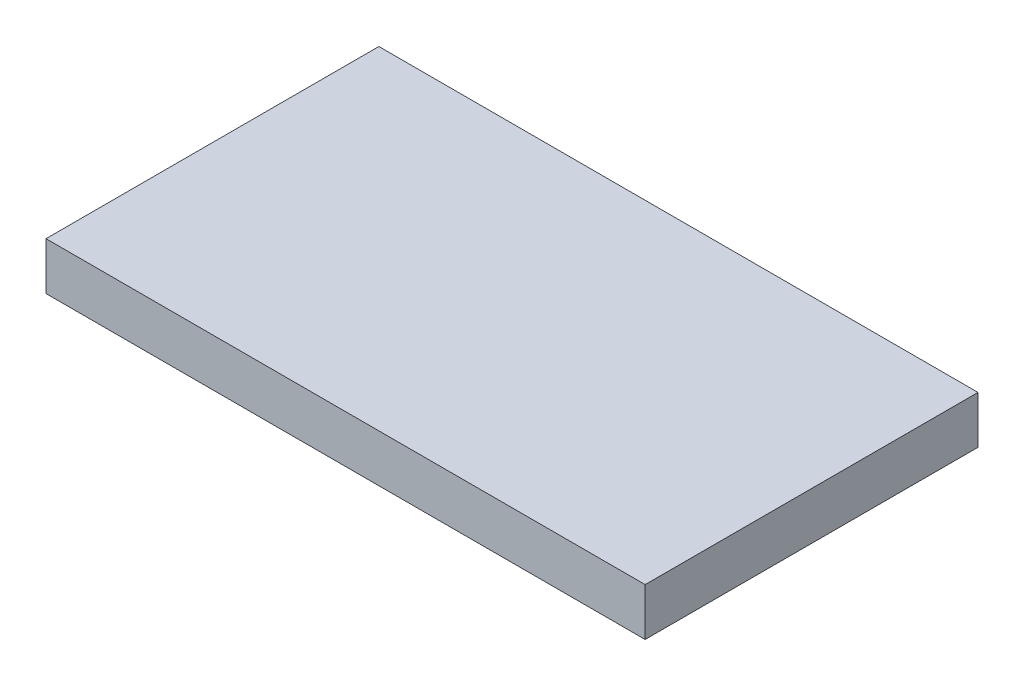
ISO-10303-21;
HEADER;
FILE_DESCRIPTION(('STEP AP214'),'2;1');
FILE_NAME('part.step','',(''),(''),'','','');
FILE_SCHEMA(('AUTOMOTIVE_DESIGN { 1 0 10303 214 1 1 1 1 }'));
ENDSEC;
DATA;
#1=APPLICATION_CONTEXT('core data for automotive mechanical design processes');
#2=APPLICATION_PROTOCOL_DEFINITION('international standard','automotive_design',2000,#1);
#3=PRODUCT_CONTEXT('',#1,'mechanical');
#4=PRODUCT('Part','Part','',(#3));
#5=PRODUCT_RELATED_PRODUCT_CATEGORY('part','',(#4));
#6=PRODUCT_DEFINITION_FORMATION('','',#4);
#7=PRODUCT_DEFINITION_CONTEXT('part definition',#1,'design');
#8=PRODUCT_DEFINITION('design','',#6,#7);
#9=PRODUCT_DEFINITION_SHAPE('','',#8);
#10=(LENGTH_UNIT() NAMED_UNIT(*) SI_UNIT(.MILLI.,.METRE.));
#11=(NAMED_UNIT(*) PLANE_ANGLE_UNIT() SI_UNIT($,.RADIAN.));
#12=(NAMED_UNIT(*) SI_UNIT($,.STERADIAN.) SOLID_ANGLE_UNIT());
#13=UNCERTAINTY_MEASURE_WITH_UNIT(LENGTH_MEASURE(1.E-05),#10,'distance_accuracy_value','');
#14=(GEOMETRIC_REPRESENTATION_CONTEXT(3) GLOBAL_UNCERTAINTY_ASSIGNED_CONTEXT((#13)) GLOBAL_UNIT_ASSIGNED_CONTEXT((#10,
#11,#12)) REPRESENTATION_CONTEXT('',''));
#15=CARTESIAN_POINT('',(0.,0.,0.));
#16=DIRECTION('',(0.,0.,1.));
#17=DIRECTION('',(1.,0.,0.));
#18=AXIS2_PLACEMENT_3D('',#15,#16,#17);
#19=CARTESIAN_POINT('',(-51.6509531623004,5.,-20.3195374115649));
#20=DIRECTION('',(1.,0.,0.));
#21=DIRECTION('',(0.,0.,-1.));
#22=AXIS2_PLACEMENT_3D('',#19,#20,#21);
#23=PLANE('',#22);
#24=DIRECTION('',(0.,0.,1.));
#25=VECTOR('',#24,1.);
#26=CARTESIAN_POINT('',(-51.6509531623004,0.,-20.3195374115649));
#27=LINE('',#26,#25);
#28=CARTESIAN_POINT('',(-51.6509531623004,0.,-20.3195374115649));
#29=VERTEX_POINT('',#28);
#30=CARTESIAN_POINT('',(-51.6509531623004,0.,14.6804625884351));
#31=VERTEX_POINT('',#30);
#32=EDGE_CURVE('E96',#29,#31,#27,.T.);
#33=ORIENTED_EDGE('',*,*,#32,.T.);
#34=DIRECTION('',(0.,-1.,0.));
#35=VECTOR('',#34,1.);
#36=CARTESIAN_POINT('',(-51.6509531623004,5.,14.6804625884351));
#37=LINE('',#36,#35);
#38=CARTESIAN_POINT('',(-51.6509531623004,5.,14.6804625884351));
#39=VERTEX_POINT('',#38);
#40=EDGE_CURVE('E11',#39,#31,#37,.T.);
#41=ORIENTED_EDGE('',*,*,#40,.F.);
#42=DIRECTION('',(0.,0.,1.));
#43=VECTOR('',#42,1.);
#44=CARTESIAN_POINT('',(-51.6509531623004,5.,-20.3195374115649));
#45=LINE('',#44,#43);
#46=CARTESIAN_POINT('',(-51.6509531623004,5.,-20.3195374115649));
#47=VERTEX_POINT('',#46);
#48=EDGE_CURVE('E84',#47,#39,#45,.T.);
#49=ORIENTED_EDGE('',*,*,#48,.F.);
#50=DIRECTION('',(0.,-1.,0.));
#51=VECTOR('',#50,1.);
#52=CARTESIAN_POINT('',(-51.6509531623004,5.,-20.3195374115649));
#53=LINE('',#52,#51);
#54=EDGE_CURVE('E92',#47,#29,#53,.T.);
#55=ORIENTED_EDGE('',*,*,#54,.T.);
#56=EDGE_LOOP('',(#33,#41,#49,#55));
#57=FACE_BOUND('',#56,.T.);
#58=ADVANCED_FACE('F33',(#57),#23,.F.);
#59=CARTESIAN_POINT('',(-51.6509531623004,5.,14.6804625884351));
#60=DIRECTION('',(0.,0.,-1.));
#61=DIRECTION('',(-1.,0.,0.));
#62=AXIS2_PLACEMENT_3D('',#59,#60,#61);
#63=PLANE('',#62);
#64=DIRECTION('',(1.,0.,0.));
#65=VECTOR('',#64,1.);
#66=CARTESIAN_POINT('',(-51.6509531623004,0.,14.6804625884351));
#67=LINE('',#66,#65);
#68=CARTESIAN_POINT('',(11.3490468376996,0.,14.6804625884351));
#69=VERTEX_POINT('',#68);
#70=EDGE_CURVE('E88',#31,#69,#67,.T.);
#71=ORIENTED_EDGE('',*,*,#70,.T.);
#72=DIRECTION('',(0.,-1.,0.));
#73=VECTOR('',#72,1.);
#74=CARTESIAN_POINT('',(11.3490468376996,5.,14.6804625884351));
#75=LINE('',#74,#73);
#76=CARTESIAN_POINT('',(11.3490468376996,5.,14.6804625884351));
#77=VERTEX_POINT('',#76);
#78=EDGE_CURVE('E41',#77,#69,#75,.T.);
#79=ORIENTED_EDGE('',*,*,#78,.F.);
#80=DIRECTION('',(1.,0.,0.));
#81=VECTOR('',#80,1.);
#82=CARTESIAN_POINT('',(-51.6509531623004,5.,14.6804625884351));
#83=LINE('',#82,#81);
#84=EDGE_CURVE('E79',#39,#77,#83,.T.);
#85=ORIENTED_EDGE('',*,*,#84,.F.);
#86=ORIENTED_EDGE('',*,*,#40,.T.);
#87=EDGE_LOOP('',(#71,#79,#85,#86));
#88=FACE_BOUND('',#87,.T.);
#89=ADVANCED_FACE('F87',(#88),#63,.F.);
#90=CARTESIAN_POINT('',(11.3490468376996,5.,-20.3195374115649));
#91=DIRECTION('',(-1.,0.,0.));
#92=DIRECTION('',(0.,0.,1.));
#93=AXIS2_PLACEMENT_3D('',#90,#91,#92);
#94=PLANE('',#93);
#95=DIRECTION('',(0.,0.,-1.));
#96=VECTOR('',#95,1.);
#97=CARTESIAN_POINT('',(11.3490468376996,0.,-20.3195374115649));
#98=LINE('',#97,#96);
#99=CARTESIAN_POINT('',(11.3490468376996,0.,-20.3195374115649));
#100=VERTEX_POINT('',#99);
#101=EDGE_CURVE('E66',#69,#100,#98,.T.);
#102=ORIENTED_EDGE('',*,*,#101,.T.);
#103=DIRECTION('',(0.,-1.,0.));
#104=VECTOR('',#103,1.);
#105=CARTESIAN_POINT('',(11.3490468376996,5.,-20.3195374115649));
#106=LINE('',#105,#104);
#107=CARTESIAN_POINT('',(11.3490468376996,5.,-20.3195374115649));
#108=VERTEX_POINT('',#107);
#109=EDGE_CURVE('E89',#108,#100,#106,.T.);
#110=ORIENTED_EDGE('',*,*,#109,.F.);
#111=DIRECTION('',(0.,0.,-1.));
#112=VECTOR('',#111,1.);
#113=CARTESIAN_POINT('',(11.3490468376996,5.,-20.3195374115649));
#114=LINE('',#113,#112);
#115=EDGE_CURVE('E82',#77,#108,#114,.T.);
#116=ORIENTED_EDGE('',*,*,#115,.F.);
#117=ORIENTED_EDGE('',*,*,#78,.T.);
#118=EDGE_LOOP('',(#102,#110,#116,#117));
#119=FACE_BOUND('',#118,.T.);
#120=ADVANCED_FACE('F90',(#119),#94,.F.);
#121=CARTESIAN_POINT('',(-51.6509531623004,5.,-20.3195374115649));
#122=DIRECTION('',(0.,0.,1.));
#123=DIRECTION('',(1.,0.,0.));
#124=AXIS2_PLACEMENT_3D('',#121,#122,#123);
#125=PLANE('',#124);
#126=DIRECTION('',(-1.,0.,0.));
#127=VECTOR('',#126,1.);
#128=CARTESIAN_POINT('',(-51.6509531623004,0.,-20.3195374115649));
#129=LINE('',#128,#127);
#130=EDGE_CURVE('E72',#100,#29,#129,.T.);
#131=ORIENTED_EDGE('',*,*,#130,.T.);
#132=ORIENTED_EDGE('',*,*,#54,.F.);
#133=DIRECTION('',(-1.,0.,0.));
#134=VECTOR('',#133,1.);
#135=CARTESIAN_POINT('',(-51.6509531623004,5.,-20.3195374115649));
#136=LINE('',#135,#134);
#137=EDGE_CURVE('E49',#108,#47,#136,.T.);
#138=ORIENTED_EDGE('',*,*,#137,.F.);
#139=ORIENTED_EDGE('',*,*,#109,.T.);
#140=EDGE_LOOP('',(#131,#132,#138,#139));
#141=FACE_BOUND('',#140,.T.);
#142=ADVANCED_FACE('F103',(#141),#125,.F.);
#143=CARTESIAN_POINT('',(0.,5.,0.));
#144=DIRECTION('',(0.,1.,0.));
#145=DIRECTION('',(0.,0.,1.));
#146=AXIS2_PLACEMENT_3D('',#143,#144,#145);
#147=PLANE('',#146);
#148=ORIENTED_EDGE('',*,*,#48,.T.);
#149=ORIENTED_EDGE('',*,*,#84,.T.);
#150=ORIENTED_EDGE('',*,*,#115,.T.);
#151=ORIENTED_EDGE('',*,*,#137,.T.);
#152=EDGE_LOOP('',(#148,#149,#150,#151));
#153=FACE_BOUND('',#152,.T.);
#154=ADVANCED_FACE('F80',(#153),#147,.T.);
#155=CARTESIAN_POINT('',(0.,0.,0.));
#156=DIRECTION('',(0.,1.,0.));
#157=DIRECTION('',(0.,0.,1.));
#158=AXIS2_PLACEMENT_3D('',#155,#156,#157);
#159=PLANE('',#158);
#160=ORIENTED_EDGE('',*,*,#32,.F.);
#161=ORIENTED_EDGE('',*,*,#130,.F.);
#162=ORIENTED_EDGE('',*,*,#101,.F.);
#163=ORIENTED_EDGE('',*,*,#70,.F.);
#164=EDGE_LOOP('',(#160,#161,#162,#163));
#165=FACE_BOUND('',#164,.T.);
#166=ADVANCED_FACE('F106',(#165),#159,.F.);
#167=CLOSED_SHELL('',(#58,#89,#120,#142,#154,#166));
#168=MANIFOLD_SOLID_BREP('B2',#167);
#169=ADVANCED_BREP_SHAPE_REPRESENTATION('',(#18,#168),#14);
#170=SHAPE_DEFINITION_REPRESENTATION(#9,#169);
ENDSEC;
END-ISO-10303-21;
